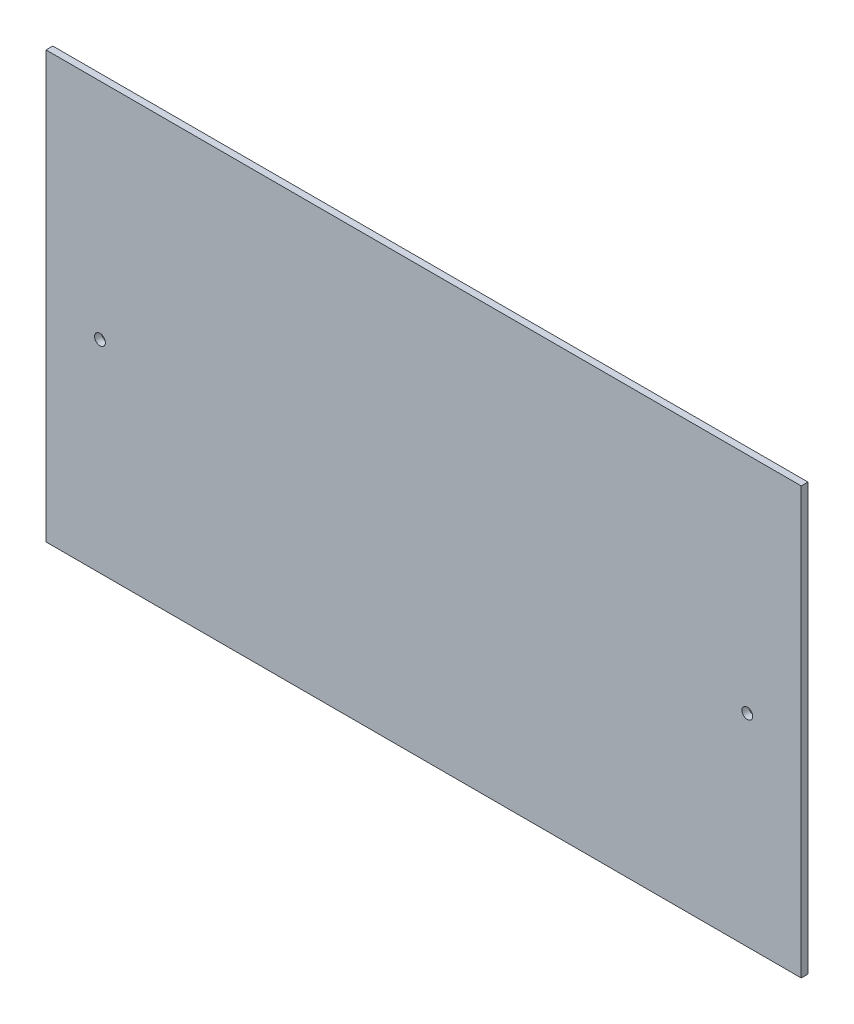
ISO-10303-21;
HEADER;
FILE_DESCRIPTION(('STEP AP214'),'2;1');
FILE_NAME('part.step','',(''),(''),'','','');
FILE_SCHEMA(('AUTOMOTIVE_DESIGN { 1 0 10303 214 1 1 1 1 }'));
ENDSEC;
DATA;
#1=APPLICATION_CONTEXT('core data for automotive mechanical design processes');
#2=APPLICATION_PROTOCOL_DEFINITION('international standard','automotive_design',2000,#1);
#3=PRODUCT_CONTEXT('',#1,'mechanical');
#4=PRODUCT('Part','Part','',(#3));
#5=PRODUCT_RELATED_PRODUCT_CATEGORY('part','',(#4));
#6=PRODUCT_DEFINITION_FORMATION('','',#4);
#7=PRODUCT_DEFINITION_CONTEXT('part definition',#1,'design');
#8=PRODUCT_DEFINITION('design','',#6,#7);
#9=PRODUCT_DEFINITION_SHAPE('','',#8);
#10=(LENGTH_UNIT() NAMED_UNIT(*) SI_UNIT(.MILLI.,.METRE.));
#11=(NAMED_UNIT(*) PLANE_ANGLE_UNIT() SI_UNIT($,.RADIAN.));
#12=(NAMED_UNIT(*) SI_UNIT($,.STERADIAN.) SOLID_ANGLE_UNIT());
#13=UNCERTAINTY_MEASURE_WITH_UNIT(LENGTH_MEASURE(1.E-05),#10,'distance_accuracy_value','');
#14=(GEOMETRIC_REPRESENTATION_CONTEXT(3) GLOBAL_UNCERTAINTY_ASSIGNED_CONTEXT((#13)) GLOBAL_UNIT_ASSIGNED_CONTEXT((#10,
#11,#12)) REPRESENTATION_CONTEXT('',''));
#15=CARTESIAN_POINT('',(0.,0.,0.));
#16=DIRECTION('',(0.,0.,1.));
#17=DIRECTION('',(1.,0.,0.));
#18=AXIS2_PLACEMENT_3D('',#15,#16,#17);
#19=CARTESIAN_POINT('',(0.,0.,2.5));
#20=DIRECTION('',(1.,0.,0.));
#21=DIRECTION('',(0.,0.,-1.));
#22=AXIS2_PLACEMENT_3D('',#19,#20,#21);
#23=PLANE('',#22);
#24=DIRECTION('',(0.,-1.,0.));
#25=VECTOR('',#24,1.);
#26=CARTESIAN_POINT('',(0.,0.,0.));
#27=LINE('',#26,#25);
#28=CARTESIAN_POINT('',(0.,158.,0.));
#29=VERTEX_POINT('',#28);
#30=CARTESIAN_POINT('',(0.,0.,0.));
#31=VERTEX_POINT('',#30);
#32=EDGE_CURVE('E103',#29,#31,#27,.T.);
#33=ORIENTED_EDGE('',*,*,#32,.T.);
#34=DIRECTION('',(0.,0.,-1.));
#35=VECTOR('',#34,1.);
#36=CARTESIAN_POINT('',(0.,0.,2.5));
#37=LINE('',#36,#35);
#38=CARTESIAN_POINT('',(0.,0.,2.5));
#39=VERTEX_POINT('',#38);
#40=EDGE_CURVE('E11',#39,#31,#37,.T.);
#41=ORIENTED_EDGE('',*,*,#40,.F.);
#42=DIRECTION('',(0.,-1.,0.));
#43=VECTOR('',#42,1.);
#44=CARTESIAN_POINT('',(0.,0.,2.5));
#45=LINE('',#44,#43);
#46=CARTESIAN_POINT('',(0.,158.,2.5));
#47=VERTEX_POINT('',#46);
#48=EDGE_CURVE('E90',#47,#39,#45,.T.);
#49=ORIENTED_EDGE('',*,*,#48,.F.);
#50=DIRECTION('',(0.,0.,-1.));
#51=VECTOR('',#50,1.);
#52=CARTESIAN_POINT('',(0.,158.,2.5));
#53=LINE('',#52,#51);
#54=EDGE_CURVE('E99',#47,#29,#53,.T.);
#55=ORIENTED_EDGE('',*,*,#54,.T.);
#56=EDGE_LOOP('',(#33,#41,#49,#55));
#57=FACE_BOUND('',#56,.T.);
#58=ADVANCED_FACE('F37',(#57),#23,.F.);
#59=CARTESIAN_POINT('',(0.,0.,2.5));
#60=DIRECTION('',(0.,1.,0.));
#61=DIRECTION('',(0.,0.,1.));
#62=AXIS2_PLACEMENT_3D('',#59,#60,#61);
#63=PLANE('',#62);
#64=DIRECTION('',(1.,0.,0.));
#65=VECTOR('',#64,1.);
#66=CARTESIAN_POINT('',(0.,0.,0.));
#67=LINE('',#66,#65);
#68=CARTESIAN_POINT('',(280.,0.,0.));
#69=VERTEX_POINT('',#68);
#70=EDGE_CURVE('E94',#31,#69,#67,.T.);
#71=ORIENTED_EDGE('',*,*,#70,.T.);
#72=DIRECTION('',(0.,0.,-1.));
#73=VECTOR('',#72,1.);
#74=CARTESIAN_POINT('',(280.,0.,2.5));
#75=LINE('',#74,#73);
#76=CARTESIAN_POINT('',(280.,0.,2.5));
#77=VERTEX_POINT('',#76);
#78=EDGE_CURVE('E46',#77,#69,#75,.T.);
#79=ORIENTED_EDGE('',*,*,#78,.F.);
#80=DIRECTION('',(1.,0.,0.));
#81=VECTOR('',#80,1.);
#82=CARTESIAN_POINT('',(0.,0.,2.5));
#83=LINE('',#82,#81);
#84=EDGE_CURVE('E85',#39,#77,#83,.T.);
#85=ORIENTED_EDGE('',*,*,#84,.F.);
#86=ORIENTED_EDGE('',*,*,#40,.T.);
#87=EDGE_LOOP('',(#71,#79,#85,#86));
#88=FACE_BOUND('',#87,.T.);
#89=ADVANCED_FACE('F93',(#88),#63,.F.);
#90=CARTESIAN_POINT('',(280.,0.,2.5));
#91=DIRECTION('',(-1.,0.,0.));
#92=DIRECTION('',(0.,0.,1.));
#93=AXIS2_PLACEMENT_3D('',#90,#91,#92);
#94=PLANE('',#93);
#95=DIRECTION('',(0.,1.,0.));
#96=VECTOR('',#95,1.);
#97=CARTESIAN_POINT('',(280.,0.,0.));
#98=LINE('',#97,#96);
#99=CARTESIAN_POINT('',(280.,158.,0.));
#100=VERTEX_POINT('',#99);
#101=EDGE_CURVE('E72',#69,#100,#98,.T.);
#102=ORIENTED_EDGE('',*,*,#101,.T.);
#103=DIRECTION('',(0.,0.,-1.));
#104=VECTOR('',#103,1.);
#105=CARTESIAN_POINT('',(280.,158.,2.5));
#106=LINE('',#105,#104);
#107=CARTESIAN_POINT('',(280.,158.,2.5));
#108=VERTEX_POINT('',#107);
#109=EDGE_CURVE('E95',#108,#100,#106,.T.);
#110=ORIENTED_EDGE('',*,*,#109,.F.);
#111=DIRECTION('',(0.,1.,0.));
#112=VECTOR('',#111,1.);
#113=CARTESIAN_POINT('',(280.,0.,2.5));
#114=LINE('',#113,#112);
#115=EDGE_CURVE('E88',#77,#108,#114,.T.);
#116=ORIENTED_EDGE('',*,*,#115,.F.);
#117=ORIENTED_EDGE('',*,*,#78,.T.);
#118=EDGE_LOOP('',(#102,#110,#116,#117));
#119=FACE_BOUND('',#118,.T.);
#120=ADVANCED_FACE('F97',(#119),#94,.F.);
#121=CARTESIAN_POINT('',(0.,158.,2.5));
#122=DIRECTION('',(0.,-1.,0.));
#123=DIRECTION('',(0.,0.,-1.));
#124=AXIS2_PLACEMENT_3D('',#121,#122,#123);
#125=PLANE('',#124);
#126=DIRECTION('',(-1.,0.,0.));
#127=VECTOR('',#126,1.);
#128=CARTESIAN_POINT('',(0.,158.,0.));
#129=LINE('',#128,#127);
#130=EDGE_CURVE('E78',#100,#29,#129,.T.);
#131=ORIENTED_EDGE('',*,*,#130,.T.);
#132=ORIENTED_EDGE('',*,*,#54,.F.);
#133=DIRECTION('',(-1.,0.,0.));
#134=VECTOR('',#133,1.);
#135=CARTESIAN_POINT('',(0.,158.,2.5));
#136=LINE('',#135,#134);
#137=EDGE_CURVE('E55',#108,#47,#136,.T.);
#138=ORIENTED_EDGE('',*,*,#137,.F.);
#139=ORIENTED_EDGE('',*,*,#109,.T.);
#140=EDGE_LOOP('',(#131,#132,#138,#139));
#141=FACE_BOUND('',#140,.T.);
#142=ADVANCED_FACE('F129',(#141),#125,.F.);
#143=CARTESIAN_POINT('',(0.,0.,2.5));
#144=DIRECTION('',(0.,0.,-1.));
#145=DIRECTION('',(-1.,0.,0.));
#146=AXIS2_PLACEMENT_3D('',#143,#144,#145);
#147=PLANE('',#146);
#148=CARTESIAN_POINT('',(260.,75.,2.5));
#149=DIRECTION('',(0.,0.,1.));
#150=DIRECTION('',(1.,0.,0.));
#151=AXIS2_PLACEMENT_3D('',#148,#149,#150);
#152=CIRCLE('',#151,2.);
#153=CARTESIAN_POINT('',(262.,75.,2.5));
#154=VERTEX_POINT('',#153);
#155=EDGE_CURVE('E112',#154,#154,#152,.T.);
#156=ORIENTED_EDGE('',*,*,#155,.F.);
#157=EDGE_LOOP('',(#156));
#158=FACE_BOUND('',#157,.T.);
#159=CARTESIAN_POINT('',(20.,75.,2.5));
#160=DIRECTION('',(0.,0.,1.));
#161=DIRECTION('',(1.,0.,0.));
#162=AXIS2_PLACEMENT_3D('',#159,#160,#161);
#163=CIRCLE('',#162,2.);
#164=CARTESIAN_POINT('',(22.,75.,2.5));
#165=VERTEX_POINT('',#164);
#166=EDGE_CURVE('E117',#165,#165,#163,.T.);
#167=ORIENTED_EDGE('',*,*,#166,.F.);
#168=EDGE_LOOP('',(#167));
#169=FACE_BOUND('',#168,.T.);
#170=ORIENTED_EDGE('',*,*,#48,.T.);
#171=ORIENTED_EDGE('',*,*,#84,.T.);
#172=ORIENTED_EDGE('',*,*,#115,.T.);
#173=ORIENTED_EDGE('',*,*,#137,.T.);
#174=EDGE_LOOP('',(#170,#171,#172,#173));
#175=FACE_BOUND('',#174,.T.);
#176=ADVANCED_FACE('F86',(#158,#169,#175),#147,.F.);
#177=CARTESIAN_POINT('',(0.,0.,0.));
#178=DIRECTION('',(0.,0.,-1.));
#179=DIRECTION('',(-1.,0.,0.));
#180=AXIS2_PLACEMENT_3D('',#177,#178,#179);
#181=PLANE('',#180);
#182=CARTESIAN_POINT('',(260.,75.,0.));
#183=DIRECTION('',(0.,0.,-1.));
#184=DIRECTION('',(-1.,0.,0.));
#185=AXIS2_PLACEMENT_3D('',#182,#183,#184);
#186=CIRCLE('',#185,2.);
#187=CARTESIAN_POINT('',(258.,75.,0.));
#188=VERTEX_POINT('',#187);
#189=EDGE_CURVE('E40',#188,#188,#186,.T.);
#190=ORIENTED_EDGE('',*,*,#189,.F.);
#191=EDGE_LOOP('',(#190));
#192=FACE_BOUND('',#191,.T.);
#193=CARTESIAN_POINT('',(20.,75.,0.));
#194=DIRECTION('',(0.,0.,-1.));
#195=DIRECTION('',(-1.,0.,0.));
#196=AXIS2_PLACEMENT_3D('',#193,#194,#195);
#197=CIRCLE('',#196,2.);
#198=CARTESIAN_POINT('',(18.,75.,0.));
#199=VERTEX_POINT('',#198);
#200=EDGE_CURVE('E110',#199,#199,#197,.T.);
#201=ORIENTED_EDGE('',*,*,#200,.F.);
#202=EDGE_LOOP('',(#201));
#203=FACE_BOUND('',#202,.T.);
#204=ORIENTED_EDGE('',*,*,#32,.F.);
#205=ORIENTED_EDGE('',*,*,#130,.F.);
#206=ORIENTED_EDGE('',*,*,#101,.F.);
#207=ORIENTED_EDGE('',*,*,#70,.F.);
#208=EDGE_LOOP('',(#204,#205,#206,#207));
#209=FACE_BOUND('',#208,.T.);
#210=ADVANCED_FACE('F128',(#192,#203,#209),#181,.T.);
#211=CARTESIAN_POINT('',(20.,75.,-7.5));
#212=DIRECTION('',(0.,0.,1.));
#213=DIRECTION('',(1.,0.,0.));
#214=AXIS2_PLACEMENT_3D('',#211,#212,#213);
#215=CYLINDRICAL_SURFACE('',#214,2.);
#216=ORIENTED_EDGE('',*,*,#200,.T.);
#217=EDGE_LOOP('',(#216));
#218=FACE_BOUND('',#217,.T.);
#219=ORIENTED_EDGE('',*,*,#166,.T.);
#220=EDGE_LOOP('',(#219));
#221=FACE_BOUND('',#220,.T.);
#222=ADVANCED_FACE('F125',(#218,#221),#215,.F.);
#223=CARTESIAN_POINT('',(260.,75.,-7.5));
#224=DIRECTION('',(0.,0.,1.));
#225=DIRECTION('',(1.,0.,0.));
#226=AXIS2_PLACEMENT_3D('',#223,#224,#225);
#227=CYLINDRICAL_SURFACE('',#226,2.);
#228=ORIENTED_EDGE('',*,*,#189,.T.);
#229=EDGE_LOOP('',(#228));
#230=FACE_BOUND('',#229,.T.);
#231=ORIENTED_EDGE('',*,*,#155,.T.);
#232=EDGE_LOOP('',(#231));
#233=FACE_BOUND('',#232,.T.);
#234=ADVANCED_FACE('F179',(#230,#233),#227,.F.);
#235=CLOSED_SHELL('',(#58,#89,#120,#142,#176,#210,#222,#234));
#236=MANIFOLD_SOLID_BREP('B2',#235);
#237=ADVANCED_BREP_SHAPE_REPRESENTATION('',(#18,#236),#14);
#238=SHAPE_DEFINITION_REPRESENTATION(#9,#237);
ENDSEC;
END-ISO-10303-21;
